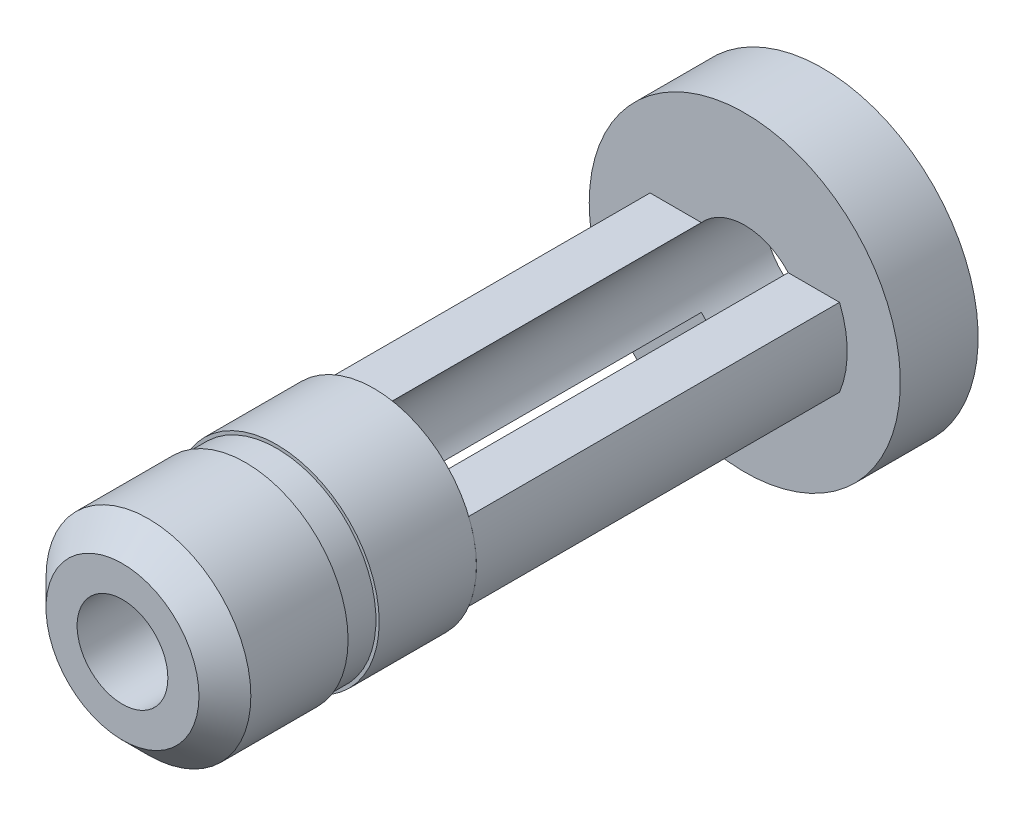
ISO-10303-21;
HEADER;
FILE_DESCRIPTION(('STEP AP214'),'2;1');
FILE_NAME('part.step','',(''),(''),'','','');
FILE_SCHEMA(('AUTOMOTIVE_DESIGN { 1 0 10303 214 1 1 1 1 }'));
ENDSEC;
DATA;
#1=APPLICATION_CONTEXT('core data for automotive mechanical design processes');
#2=APPLICATION_PROTOCOL_DEFINITION('international standard','automotive_design',2000,#1);
#3=PRODUCT_CONTEXT('',#1,'mechanical');
#4=PRODUCT('Part','Part','',(#3));
#5=PRODUCT_RELATED_PRODUCT_CATEGORY('part','',(#4));
#6=PRODUCT_DEFINITION_FORMATION('','',#4);
#7=PRODUCT_DEFINITION_CONTEXT('part definition',#1,'design');
#8=PRODUCT_DEFINITION('design','',#6,#7);
#9=PRODUCT_DEFINITION_SHAPE('','',#8);
#10=(LENGTH_UNIT() NAMED_UNIT(*) SI_UNIT(.MILLI.,.METRE.));
#11=(NAMED_UNIT(*) PLANE_ANGLE_UNIT() SI_UNIT($,.RADIAN.));
#12=(NAMED_UNIT(*) SI_UNIT($,.STERADIAN.) SOLID_ANGLE_UNIT());
#13=UNCERTAINTY_MEASURE_WITH_UNIT(LENGTH_MEASURE(1.E-05),#10,'distance_accuracy_value','');
#14=(GEOMETRIC_REPRESENTATION_CONTEXT(3) GLOBAL_UNCERTAINTY_ASSIGNED_CONTEXT((#13)) GLOBAL_UNIT_ASSIGNED_CONTEXT((#10,
#11,#12)) REPRESENTATION_CONTEXT('',''));
#15=CARTESIAN_POINT('',(0.,0.,0.));
#16=DIRECTION('',(0.,0.,1.));
#17=DIRECTION('',(1.,0.,0.));
#18=AXIS2_PLACEMENT_3D('',#15,#16,#17);
#19=CARTESIAN_POINT('',(0.,0.,-28.6));
#20=DIRECTION('',(0.,0.,-1.));
#21=DIRECTION('',(-1.,0.,0.));
#22=AXIS2_PLACEMENT_3D('',#19,#20,#21);
#23=PLANE('',#22);
#24=CARTESIAN_POINT('',(0.,0.,-28.6));
#25=DIRECTION('',(0.,0.,-1.));
#26=DIRECTION('',(-1.,0.,0.));
#27=AXIS2_PLACEMENT_3D('',#24,#25,#26);
#28=CIRCLE('',#27,12.);
#29=CARTESIAN_POINT('',(-12.,0.,-28.6));
#30=VERTEX_POINT('',#29);
#31=EDGE_CURVE('E204',#30,#30,#28,.T.);
#32=ORIENTED_EDGE('',*,*,#31,.F.);
#33=EDGE_LOOP('',(#32));
#34=FACE_BOUND('',#33,.T.);
#35=DIRECTION('',(-1.,0.,0.));
#36=VECTOR('',#35,1.);
#37=CARTESIAN_POINT('',(0.,3.00417782443189,-28.6));
#38=LINE('',#37,#36);
#39=CARTESIAN_POINT('',(-3.35036051779382,3.00417782443189,-28.6));
#40=VERTEX_POINT('',#39);
#41=CARTESIAN_POINT('',(-7.30649817622585,3.00417782443189,-28.6));
#42=VERTEX_POINT('',#41);
#43=EDGE_CURVE('E12',#40,#42,#38,.T.);
#44=ORIENTED_EDGE('',*,*,#43,.F.);
#45=CARTESIAN_POINT('',(0.,0.,-28.6));
#46=DIRECTION('',(0.,0.,-1.));
#47=DIRECTION('',(-1.,0.,0.));
#48=AXIS2_PLACEMENT_3D('',#45,#46,#47);
#49=CIRCLE('',#48,4.5);
#50=CARTESIAN_POINT('',(3.35036051779382,3.00417782443189,-28.6));
#51=VERTEX_POINT('',#50);
#52=EDGE_CURVE('E134',#51,#40,#49,.F.);
#53=ORIENTED_EDGE('',*,*,#52,.F.);
#54=DIRECTION('',(-1.,0.,0.));
#55=VECTOR('',#54,1.);
#56=CARTESIAN_POINT('',(0.,3.00417782443189,-28.6));
#57=LINE('',#56,#55);
#58=CARTESIAN_POINT('',(7.30649817622585,3.00417782443189,-28.6));
#59=VERTEX_POINT('',#58);
#60=EDGE_CURVE('E184',#59,#51,#57,.T.);
#61=ORIENTED_EDGE('',*,*,#60,.F.);
#62=CARTESIAN_POINT('',(0.,0.,-28.6));
#63=DIRECTION('',(0.,0.,-1.));
#64=DIRECTION('',(-1.,0.,0.));
#65=AXIS2_PLACEMENT_3D('',#62,#63,#64);
#66=CIRCLE('',#65,7.9);
#67=CARTESIAN_POINT('',(7.30805066811138,-3.00039921215774,-28.6));
#68=VERTEX_POINT('',#67);
#69=EDGE_CURVE('E85',#59,#68,#66,.T.);
#70=ORIENTED_EDGE('',*,*,#69,.T.);
#71=DIRECTION('',(1.,0.,0.));
#72=VECTOR('',#71,1.);
#73=CARTESIAN_POINT('',(7.30805066811138,-3.00039921215774,-28.6));
#74=LINE('',#73,#72);
#75=CARTESIAN_POINT('',(3.35374485727272,-3.00039921215774,-28.6));
#76=VERTEX_POINT('',#75);
#77=EDGE_CURVE('E131',#76,#68,#74,.T.);
#78=ORIENTED_EDGE('',*,*,#77,.F.);
#79=CARTESIAN_POINT('',(-3.35374485727272,-3.00039921215774,-28.6));
#80=VERTEX_POINT('',#79);
#81=EDGE_CURVE('E78',#80,#76,#49,.F.);
#82=ORIENTED_EDGE('',*,*,#81,.F.);
#83=DIRECTION('',(1.,0.,0.));
#84=VECTOR('',#83,1.);
#85=CARTESIAN_POINT('',(7.30805066811138,-3.00039921215774,-28.6));
#86=LINE('',#85,#84);
#87=CARTESIAN_POINT('',(-7.30805066811138,-3.00039921215775,-28.6));
#88=VERTEX_POINT('',#87);
#89=EDGE_CURVE('E130',#88,#80,#86,.T.);
#90=ORIENTED_EDGE('',*,*,#89,.F.);
#91=CARTESIAN_POINT('',(0.,0.,-28.6));
#92=DIRECTION('',(0.,0.,-1.));
#93=DIRECTION('',(-1.,0.,0.));
#94=AXIS2_PLACEMENT_3D('',#91,#92,#93);
#95=CIRCLE('',#94,7.9);
#96=EDGE_CURVE('E157',#88,#42,#95,.T.);
#97=ORIENTED_EDGE('',*,*,#96,.T.);
#98=EDGE_LOOP('',(#44,#53,#61,#70,#78,#82,#90,#97));
#99=FACE_BOUND('',#98,.T.);
#100=ADVANCED_FACE('F61',(#34,#99),#23,.F.);
#101=CARTESIAN_POINT('',(0.,0.,0.));
#102=DIRECTION('',(0.,0.,-1.));
#103=DIRECTION('',(-1.,0.,0.));
#104=AXIS2_PLACEMENT_3D('',#101,#102,#103);
#105=PLANE('',#104);
#106=CARTESIAN_POINT('',(0.,0.,0.));
#107=DIRECTION('',(0.,0.,-1.));
#108=DIRECTION('',(-1.,0.,0.));
#109=AXIS2_PLACEMENT_3D('',#106,#107,#108);
#110=CIRCLE('',#109,4.5);
#111=CARTESIAN_POINT('',(-3.35374485727272,-3.00039921215774,0.));
#112=VERTEX_POINT('',#111);
#113=CARTESIAN_POINT('',(-3.35036051779382,3.00417782443189,0.));
#114=VERTEX_POINT('',#113);
#115=EDGE_CURVE('E148',#112,#114,#110,.T.);
#116=ORIENTED_EDGE('',*,*,#115,.T.);
#117=DIRECTION('',(-1.,0.,0.));
#118=VECTOR('',#117,1.);
#119=CARTESIAN_POINT('',(0.,3.00417782443189,0.));
#120=LINE('',#119,#118);
#121=CARTESIAN_POINT('',(-7.30649817622585,3.00417782443189,0.));
#122=VERTEX_POINT('',#121);
#123=EDGE_CURVE('E163',#114,#122,#120,.T.);
#124=ORIENTED_EDGE('',*,*,#123,.T.);
#125=CARTESIAN_POINT('',(0.,0.,0.));
#126=DIRECTION('',(0.,0.,-1.));
#127=DIRECTION('',(-1.,0.,0.));
#128=AXIS2_PLACEMENT_3D('',#125,#126,#127);
#129=CIRCLE('',#128,7.9);
#130=CARTESIAN_POINT('',(-7.30805066811138,-3.00039921215775,0.));
#131=VERTEX_POINT('',#130);
#132=EDGE_CURVE('E152',#131,#122,#129,.T.);
#133=ORIENTED_EDGE('',*,*,#132,.F.);
#134=DIRECTION('',(1.,0.,0.));
#135=VECTOR('',#134,1.);
#136=CARTESIAN_POINT('',(0.,-3.00039921215774,0.));
#137=LINE('',#136,#135);
#138=EDGE_CURVE('E65',#131,#112,#137,.T.);
#139=ORIENTED_EDGE('',*,*,#138,.T.);
#140=EDGE_LOOP('',(#116,#124,#133,#139));
#141=FACE_BOUND('',#140,.T.);
#142=ADVANCED_FACE('F167',(#141),#105,.F.);
#143=CARTESIAN_POINT('',(0.,0.,-28.6));
#144=DIRECTION('',(0.,0.,1.));
#145=DIRECTION('',(1.,0.,0.));
#146=AXIS2_PLACEMENT_3D('',#143,#144,#145);
#147=CYLINDRICAL_SURFACE('',#146,7.9);
#148=ORIENTED_EDGE('',*,*,#132,.T.);
#149=DIRECTION('',(0.,0.,-1.));
#150=VECTOR('',#149,1.);
#151=CARTESIAN_POINT('',(-7.30649817622585,3.00417782443189,0.));
#152=LINE('',#151,#150);
#153=EDGE_CURVE('E149',#122,#42,#152,.T.);
#154=ORIENTED_EDGE('',*,*,#153,.T.);
#155=ORIENTED_EDGE('',*,*,#96,.F.);
#156=DIRECTION('',(0.,0.,-1.));
#157=VECTOR('',#156,1.);
#158=CARTESIAN_POINT('',(-7.30805066811138,-3.00039921215775,0.));
#159=LINE('',#158,#157);
#160=EDGE_CURVE('E141',#131,#88,#159,.T.);
#161=ORIENTED_EDGE('',*,*,#160,.F.);
#162=EDGE_LOOP('',(#148,#154,#155,#161));
#163=FACE_BOUND('',#162,.T.);
#164=ADVANCED_FACE('F169',(#163),#147,.T.);
#165=CARTESIAN_POINT('',(0.,0.,-28.6));
#166=DIRECTION('',(0.,0.,1.));
#167=DIRECTION('',(1.,0.,0.));
#168=AXIS2_PLACEMENT_3D('',#165,#166,#167);
#169=CYLINDRICAL_SURFACE('',#168,4.5);
#170=DIRECTION('',(0.,0.,1.));
#171=VECTOR('',#170,1.);
#172=CARTESIAN_POINT('',(-3.35036051779382,3.00417782443189,-28.6));
#173=LINE('',#172,#171);
#174=EDGE_CURVE('E70',#114,#40,#173,.F.);
#175=ORIENTED_EDGE('',*,*,#174,.F.);
#176=ORIENTED_EDGE('',*,*,#115,.F.);
#177=DIRECTION('',(0.,0.,1.));
#178=VECTOR('',#177,1.);
#179=CARTESIAN_POINT('',(-3.35374485727272,-3.00039921215774,-28.6));
#180=LINE('',#179,#178);
#181=EDGE_CURVE('E138',#80,#112,#180,.T.);
#182=ORIENTED_EDGE('',*,*,#181,.F.);
#183=ORIENTED_EDGE('',*,*,#81,.T.);
#184=DIRECTION('',(0.,0.,1.));
#185=VECTOR('',#184,1.);
#186=CARTESIAN_POINT('',(3.35374485727272,-3.00039921215774,-28.6));
#187=LINE('',#186,#185);
#188=CARTESIAN_POINT('',(3.35374485727272,-3.00039921215774,0.));
#189=VERTEX_POINT('',#188);
#190=EDGE_CURVE('E199',#189,#76,#187,.F.);
#191=ORIENTED_EDGE('',*,*,#190,.F.);
#192=CARTESIAN_POINT('',(0.,0.,0.));
#193=DIRECTION('',(0.,0.,-1.));
#194=DIRECTION('',(-1.,0.,0.));
#195=AXIS2_PLACEMENT_3D('',#192,#193,#194);
#196=CIRCLE('',#195,4.5);
#197=CARTESIAN_POINT('',(3.35036051779382,3.00417782443189,0.));
#198=VERTEX_POINT('',#197);
#199=EDGE_CURVE('E188',#198,#189,#196,.T.);
#200=ORIENTED_EDGE('',*,*,#199,.F.);
#201=DIRECTION('',(0.,0.,1.));
#202=VECTOR('',#201,1.);
#203=CARTESIAN_POINT('',(3.35036051779382,3.00417782443189,-28.6));
#204=LINE('',#203,#202);
#205=EDGE_CURVE('E175',#51,#198,#204,.T.);
#206=ORIENTED_EDGE('',*,*,#205,.F.);
#207=ORIENTED_EDGE('',*,*,#52,.T.);
#208=EDGE_LOOP('',(#175,#176,#182,#183,#191,#200,#206,#207));
#209=FACE_BOUND('',#208,.T.);
#210=CARTESIAN_POINT('',(0.,0.,-34.6));
#211=DIRECTION('',(0.,0.,-1.));
#212=DIRECTION('',(-1.,0.,0.));
#213=AXIS2_PLACEMENT_3D('',#210,#211,#212);
#214=CIRCLE('',#213,4.5);
#215=CARTESIAN_POINT('',(-4.5,0.,-34.6));
#216=VERTEX_POINT('',#215);
#217=EDGE_CURVE('E176',#216,#216,#214,.T.);
#218=ORIENTED_EDGE('',*,*,#217,.T.);
#219=EDGE_LOOP('',(#218));
#220=FACE_BOUND('',#219,.T.);
#221=ADVANCED_FACE('F145',(#209,#220),#169,.F.);
#222=CARTESIAN_POINT('',(7.30805066811138,-3.00039921215774,0.));
#223=DIRECTION('',(0.,1.,0.));
#224=DIRECTION('',(0.,0.,1.));
#225=AXIS2_PLACEMENT_3D('',#222,#223,#224);
#226=PLANE('',#225);
#227=ORIENTED_EDGE('',*,*,#181,.T.);
#228=ORIENTED_EDGE('',*,*,#138,.F.);
#229=ORIENTED_EDGE('',*,*,#160,.T.);
#230=ORIENTED_EDGE('',*,*,#89,.T.);
#231=EDGE_LOOP('',(#227,#228,#229,#230));
#232=FACE_BOUND('',#231,.T.);
#233=ADVANCED_FACE('F137',(#232),#226,.F.);
#234=CARTESIAN_POINT('',(0.,3.00417782443189,0.));
#235=DIRECTION('',(0.,-1.,0.));
#236=DIRECTION('',(0.,0.,-1.));
#237=AXIS2_PLACEMENT_3D('',#234,#235,#236);
#238=PLANE('',#237);
#239=ORIENTED_EDGE('',*,*,#174,.T.);
#240=ORIENTED_EDGE('',*,*,#43,.T.);
#241=ORIENTED_EDGE('',*,*,#153,.F.);
#242=ORIENTED_EDGE('',*,*,#123,.F.);
#243=EDGE_LOOP('',(#239,#240,#241,#242));
#244=FACE_BOUND('',#243,.T.);
#245=ADVANCED_FACE('F63',(#244),#238,.F.);
#246=CARTESIAN_POINT('',(0.,0.,-34.6));
#247=DIRECTION('',(0.,0.,1.));
#248=DIRECTION('',(1.,0.,0.));
#249=AXIS2_PLACEMENT_3D('',#246,#247,#248);
#250=CYLINDRICAL_SURFACE('',#249,12.);
#251=CARTESIAN_POINT('',(0.,0.,-34.6));
#252=DIRECTION('',(0.,0.,-1.));
#253=DIRECTION('',(-1.,0.,0.));
#254=AXIS2_PLACEMENT_3D('',#251,#252,#253);
#255=CIRCLE('',#254,12.);
#256=CARTESIAN_POINT('',(-12.,0.,-34.6));
#257=VERTEX_POINT('',#256);
#258=EDGE_CURVE('E159',#257,#257,#255,.T.);
#259=ORIENTED_EDGE('',*,*,#258,.F.);
#260=EDGE_LOOP('',(#259));
#261=FACE_BOUND('',#260,.T.);
#262=ORIENTED_EDGE('',*,*,#31,.T.);
#263=EDGE_LOOP('',(#262));
#264=FACE_BOUND('',#263,.T.);
#265=ADVANCED_FACE('F209',(#261,#264),#250,.T.);
#266=CARTESIAN_POINT('',(0.,0.,-34.6));
#267=DIRECTION('',(0.,0.,-1.));
#268=DIRECTION('',(-1.,0.,0.));
#269=AXIS2_PLACEMENT_3D('',#266,#267,#268);
#270=PLANE('',#269);
#271=ORIENTED_EDGE('',*,*,#217,.F.);
#272=EDGE_LOOP('',(#271));
#273=FACE_BOUND('',#272,.T.);
#274=ORIENTED_EDGE('',*,*,#258,.T.);
#275=EDGE_LOOP('',(#274));
#276=FACE_BOUND('',#275,.T.);
#277=ADVANCED_FACE('F221',(#273,#276),#270,.T.);
#278=CARTESIAN_POINT('',(0.,0.,-28.6));
#279=DIRECTION('',(0.,0.,1.));
#280=DIRECTION('',(1.,0.,0.));
#281=AXIS2_PLACEMENT_3D('',#278,#279,#280);
#282=CYLINDRICAL_SURFACE('',#281,7.9);
#283=ORIENTED_EDGE('',*,*,#69,.F.);
#284=DIRECTION('',(0.,0.,-1.));
#285=VECTOR('',#284,1.);
#286=CARTESIAN_POINT('',(7.30649817622585,3.00417782443189,0.));
#287=LINE('',#286,#285);
#288=CARTESIAN_POINT('',(7.30649817622585,3.00417782443189,0.));
#289=VERTEX_POINT('',#288);
#290=EDGE_CURVE('E183',#289,#59,#287,.T.);
#291=ORIENTED_EDGE('',*,*,#290,.F.);
#292=CARTESIAN_POINT('',(0.,0.,0.));
#293=DIRECTION('',(0.,0.,-1.));
#294=DIRECTION('',(-1.,0.,0.));
#295=AXIS2_PLACEMENT_3D('',#292,#293,#294);
#296=CIRCLE('',#295,7.9);
#297=CARTESIAN_POINT('',(7.30805066811138,-3.00039921215774,0.));
#298=VERTEX_POINT('',#297);
#299=EDGE_CURVE('E197',#289,#298,#296,.T.);
#300=ORIENTED_EDGE('',*,*,#299,.T.);
#301=DIRECTION('',(0.,0.,-1.));
#302=VECTOR('',#301,1.);
#303=CARTESIAN_POINT('',(7.30805066811138,-3.00039921215774,0.));
#304=LINE('',#303,#302);
#305=EDGE_CURVE('E133',#298,#68,#304,.T.);
#306=ORIENTED_EDGE('',*,*,#305,.T.);
#307=EDGE_LOOP('',(#283,#291,#300,#306));
#308=FACE_BOUND('',#307,.T.);
#309=ADVANCED_FACE('F242',(#308),#282,.T.);
#310=CARTESIAN_POINT('',(0.,0.,0.));
#311=DIRECTION('',(0.,0.,-1.));
#312=DIRECTION('',(-1.,0.,0.));
#313=AXIS2_PLACEMENT_3D('',#310,#311,#312);
#314=PLANE('',#313);
#315=ORIENTED_EDGE('',*,*,#299,.F.);
#316=DIRECTION('',(-1.,0.,0.));
#317=VECTOR('',#316,1.);
#318=CARTESIAN_POINT('',(0.,3.00417782443189,0.));
#319=LINE('',#318,#317);
#320=EDGE_CURVE('E180',#289,#198,#319,.T.);
#321=ORIENTED_EDGE('',*,*,#320,.T.);
#322=ORIENTED_EDGE('',*,*,#199,.T.);
#323=DIRECTION('',(1.,0.,0.));
#324=VECTOR('',#323,1.);
#325=CARTESIAN_POINT('',(0.,-3.00039921215774,0.));
#326=LINE('',#325,#324);
#327=EDGE_CURVE('E191',#189,#298,#326,.T.);
#328=ORIENTED_EDGE('',*,*,#327,.T.);
#329=EDGE_LOOP('',(#315,#321,#322,#328));
#330=FACE_BOUND('',#329,.T.);
#331=ADVANCED_FACE('F254',(#330),#314,.F.);
#332=CARTESIAN_POINT('',(7.30805066811138,-3.00039921215774,0.));
#333=DIRECTION('',(0.,1.,0.));
#334=DIRECTION('',(0.,0.,1.));
#335=AXIS2_PLACEMENT_3D('',#332,#333,#334);
#336=PLANE('',#335);
#337=ORIENTED_EDGE('',*,*,#190,.T.);
#338=ORIENTED_EDGE('',*,*,#77,.T.);
#339=ORIENTED_EDGE('',*,*,#305,.F.);
#340=ORIENTED_EDGE('',*,*,#327,.F.);
#341=EDGE_LOOP('',(#337,#338,#339,#340));
#342=FACE_BOUND('',#341,.T.);
#343=ADVANCED_FACE('F249',(#342),#336,.F.);
#344=CARTESIAN_POINT('',(0.,3.00417782443189,0.));
#345=DIRECTION('',(0.,-1.,0.));
#346=DIRECTION('',(0.,0.,-1.));
#347=AXIS2_PLACEMENT_3D('',#344,#345,#346);
#348=PLANE('',#347);
#349=ORIENTED_EDGE('',*,*,#205,.T.);
#350=ORIENTED_EDGE('',*,*,#320,.F.);
#351=ORIENTED_EDGE('',*,*,#290,.T.);
#352=ORIENTED_EDGE('',*,*,#60,.T.);
#353=EDGE_LOOP('',(#349,#350,#351,#352));
#354=FACE_BOUND('',#353,.T.);
#355=ADVANCED_FACE('F253',(#354),#348,.F.);
#356=CLOSED_SHELL('',(#100,#142,#164,#221,#233,#245,#265,#277,#309,#331,#343,#355));
#357=MANIFOLD_SOLID_BREP('B2',#356);
#358=CARTESIAN_POINT('',(0.,0.,19.4));
#359=DIRECTION('',(0.,0.,-1.));
#360=DIRECTION('',(-1.,0.,0.));
#361=AXIS2_PLACEMENT_3D('',#358,#359,#360);
#362=CYLINDRICAL_SURFACE('',#361,7.9);
#363=CARTESIAN_POINT('',(0.,0.,17.4));
#364=DIRECTION('',(0.,0.,1.));
#365=DIRECTION('',(1.,0.,0.));
#366=AXIS2_PLACEMENT_3D('',#363,#364,#365);
#367=CIRCLE('',#366,7.9);
#368=CARTESIAN_POINT('',(7.9,0.,17.4));
#369=VERTEX_POINT('',#368);
#370=EDGE_CURVE('E60',#369,#369,#367,.F.);
#371=ORIENTED_EDGE('',*,*,#370,.T.);
#372=EDGE_LOOP('',(#371));
#373=FACE_BOUND('',#372,.T.);
#374=CARTESIAN_POINT('',(0.,0.,9.9));
#375=DIRECTION('',(0.,0.,-1.));
#376=DIRECTION('',(-1.,0.,0.));
#377=AXIS2_PLACEMENT_3D('',#374,#375,#376);
#378=CIRCLE('',#377,7.9);
#379=CARTESIAN_POINT('',(-7.9,0.,9.9));
#380=VERTEX_POINT('',#379);
#381=EDGE_CURVE('E364',#380,#380,#378,.T.);
#382=ORIENTED_EDGE('',*,*,#381,.F.);
#383=EDGE_LOOP('',(#382));
#384=FACE_BOUND('',#383,.T.);
#385=ADVANCED_FACE('F339',(#373,#384),#362,.T.);
#386=CARTESIAN_POINT('',(0.,0.,19.4));
#387=DIRECTION('',(0.,0.,1.));
#388=DIRECTION('',(1.,0.,0.));
#389=AXIS2_PLACEMENT_3D('',#386,#387,#388);
#390=PLANE('',#389);
#391=CARTESIAN_POINT('',(0.,0.,19.4));
#392=DIRECTION('',(0.,0.,1.));
#393=DIRECTION('',(1.,0.,0.));
#394=AXIS2_PLACEMENT_3D('',#391,#392,#393);
#395=CIRCLE('',#394,5.90000000000001);
#396=CARTESIAN_POINT('',(5.90000000000001,0.,19.4));
#397=VERTEX_POINT('',#396);
#398=EDGE_CURVE('E347',#397,#397,#395,.T.);
#399=ORIENTED_EDGE('',*,*,#398,.T.);
#400=EDGE_LOOP('',(#399));
#401=FACE_BOUND('',#400,.T.);
#402=CARTESIAN_POINT('',(0.,0.,19.4));
#403=DIRECTION('',(0.,0.,1.));
#404=DIRECTION('',(1.,0.,0.));
#405=AXIS2_PLACEMENT_3D('',#402,#403,#404);
#406=CIRCLE('',#405,3.5);
#407=CARTESIAN_POINT('',(3.5,0.,19.4));
#408=VERTEX_POINT('',#407);
#409=EDGE_CURVE('E355',#408,#408,#406,.T.);
#410=ORIENTED_EDGE('',*,*,#409,.F.);
#411=EDGE_LOOP('',(#410));
#412=FACE_BOUND('',#411,.T.);
#413=ADVANCED_FACE('F395',(#401,#412),#390,.T.);
#414=CARTESIAN_POINT('',(0.,0.,0.));
#415=DIRECTION('',(0.,0.,1.));
#416=DIRECTION('',(1.,0.,0.));
#417=AXIS2_PLACEMENT_3D('',#414,#415,#416);
#418=PLANE('',#417);
#419=CARTESIAN_POINT('',(0.,0.,0.));
#420=DIRECTION('',(0.,0.,1.));
#421=DIRECTION('',(1.,0.,0.));
#422=AXIS2_PLACEMENT_3D('',#419,#420,#421);
#423=CIRCLE('',#422,7.9);
#424=CARTESIAN_POINT('',(7.9,0.,0.));
#425=VERTEX_POINT('',#424);
#426=EDGE_CURVE('E351',#425,#425,#423,.T.);
#427=ORIENTED_EDGE('',*,*,#426,.F.);
#428=EDGE_LOOP('',(#427));
#429=FACE_BOUND('',#428,.T.);
#430=CARTESIAN_POINT('',(0.,0.,0.));
#431=DIRECTION('',(0.,0.,1.));
#432=DIRECTION('',(1.,0.,0.));
#433=AXIS2_PLACEMENT_3D('',#430,#431,#432);
#434=CIRCLE('',#433,3.5);
#435=CARTESIAN_POINT('',(3.5,0.,0.));
#436=VERTEX_POINT('',#435);
#437=EDGE_CURVE('E358',#436,#436,#434,.T.);
#438=ORIENTED_EDGE('',*,*,#437,.T.);
#439=EDGE_LOOP('',(#438));
#440=FACE_BOUND('',#439,.T.);
#441=ADVANCED_FACE('F400',(#429,#440),#418,.F.);
#442=CARTESIAN_POINT('',(0.,0.,7.5));
#443=DIRECTION('',(0.,0.,-1.));
#444=DIRECTION('',(-1.,0.,0.));
#445=AXIS2_PLACEMENT_3D('',#442,#443,#444);
#446=CIRCLE('',#445,7.9);
#447=CARTESIAN_POINT('',(-7.9,0.,7.5));
#448=VERTEX_POINT('',#447);
#449=EDGE_CURVE('E361',#448,#448,#446,.T.);
#450=ORIENTED_EDGE('',*,*,#449,.T.);
#451=EDGE_LOOP('',(#450));
#452=FACE_BOUND('',#451,.T.);
#453=ORIENTED_EDGE('',*,*,#426,.T.);
#454=EDGE_LOOP('',(#453));
#455=FACE_BOUND('',#454,.T.);
#456=ADVANCED_FACE('F396',(#452,#455),#362,.T.);
#457=CARTESIAN_POINT('',(0.,0.,19.4));
#458=DIRECTION('',(0.,0.,-1.));
#459=DIRECTION('',(-1.,0.,0.));
#460=AXIS2_PLACEMENT_3D('',#457,#458,#459);
#461=CYLINDRICAL_SURFACE('',#460,3.5);
#462=ORIENTED_EDGE('',*,*,#409,.T.);
#463=EDGE_LOOP('',(#462));
#464=FACE_BOUND('',#463,.T.);
#465=ORIENTED_EDGE('',*,*,#437,.F.);
#466=EDGE_LOOP('',(#465));
#467=FACE_BOUND('',#466,.T.);
#468=ADVANCED_FACE('F405',(#464,#467),#461,.F.);
#469=CARTESIAN_POINT('',(0.,0.,19.4));
#470=DIRECTION('',(0.,0.,-1.));
#471=DIRECTION('',(-1.,0.,0.));
#472=AXIS2_PLACEMENT_3D('',#469,#470,#471);
#473=CONICAL_SURFACE('',#472,5.90000000000001,0.785398163397447);
#474=ORIENTED_EDGE('',*,*,#370,.F.);
#475=EDGE_LOOP('',(#474));
#476=FACE_BOUND('',#475,.T.);
#477=ORIENTED_EDGE('',*,*,#398,.F.);
#478=EDGE_LOOP('',(#477));
#479=FACE_BOUND('',#478,.T.);
#480=ADVANCED_FACE('F342',(#476,#479),#473,.T.);
#481=CARTESIAN_POINT('',(0.,0.,7.5));
#482=DIRECTION('',(0.,0.,-1.));
#483=DIRECTION('',(-1.,0.,0.));
#484=AXIS2_PLACEMENT_3D('',#481,#482,#483);
#485=PLANE('',#484);
#486=ORIENTED_EDGE('',*,*,#449,.F.);
#487=EDGE_LOOP('',(#486));
#488=FACE_BOUND('',#487,.T.);
#489=CARTESIAN_POINT('',(0.,0.,7.5));
#490=DIRECTION('',(0.,0.,-1.));
#491=DIRECTION('',(-1.,0.,0.));
#492=AXIS2_PLACEMENT_3D('',#489,#490,#491);
#493=CIRCLE('',#492,7.65);
#494=CARTESIAN_POINT('',(-7.65,0.,7.5));
#495=VERTEX_POINT('',#494);
#496=EDGE_CURVE('E367',#495,#495,#493,.T.);
#497=ORIENTED_EDGE('',*,*,#496,.T.);
#498=EDGE_LOOP('',(#497));
#499=FACE_BOUND('',#498,.T.);
#500=ADVANCED_FACE('F376',(#488,#499),#485,.F.);
#501=CARTESIAN_POINT('',(0.,0.,9.9));
#502=DIRECTION('',(0.,0.,-1.));
#503=DIRECTION('',(-1.,0.,0.));
#504=AXIS2_PLACEMENT_3D('',#501,#502,#503);
#505=PLANE('',#504);
#506=ORIENTED_EDGE('',*,*,#381,.T.);
#507=EDGE_LOOP('',(#506));
#508=FACE_BOUND('',#507,.T.);
#509=CARTESIAN_POINT('',(0.,0.,9.9));
#510=DIRECTION('',(0.,0.,-1.));
#511=DIRECTION('',(-1.,0.,0.));
#512=AXIS2_PLACEMENT_3D('',#509,#510,#511);
#513=CIRCLE('',#512,7.65);
#514=CARTESIAN_POINT('',(-7.65,0.,9.9));
#515=VERTEX_POINT('',#514);
#516=EDGE_CURVE('E370',#515,#515,#513,.T.);
#517=ORIENTED_EDGE('',*,*,#516,.F.);
#518=EDGE_LOOP('',(#517));
#519=FACE_BOUND('',#518,.T.);
#520=ADVANCED_FACE('F381',(#508,#519),#505,.T.);
#521=CARTESIAN_POINT('',(0.,0.,7.5));
#522=DIRECTION('',(0.,0.,1.));
#523=DIRECTION('',(1.,0.,0.));
#524=AXIS2_PLACEMENT_3D('',#521,#522,#523);
#525=CYLINDRICAL_SURFACE('',#524,7.65);
#526=ORIENTED_EDGE('',*,*,#496,.F.);
#527=EDGE_LOOP('',(#526));
#528=FACE_BOUND('',#527,.T.);
#529=ORIENTED_EDGE('',*,*,#516,.T.);
#530=EDGE_LOOP('',(#529));
#531=FACE_BOUND('',#530,.T.);
#532=ADVANCED_FACE('F378',(#528,#531),#525,.T.);
#533=CLOSED_SHELL('',(#385,#413,#441,#456,#468,#480,#500,#520,#532));
#534=MANIFOLD_SOLID_BREP('B6',#533);
#535=ADVANCED_BREP_SHAPE_REPRESENTATION('',(#18,#357,#534),#14);
#536=SHAPE_DEFINITION_REPRESENTATION(#9,#535);
ENDSEC;
END-ISO-10303-21;
